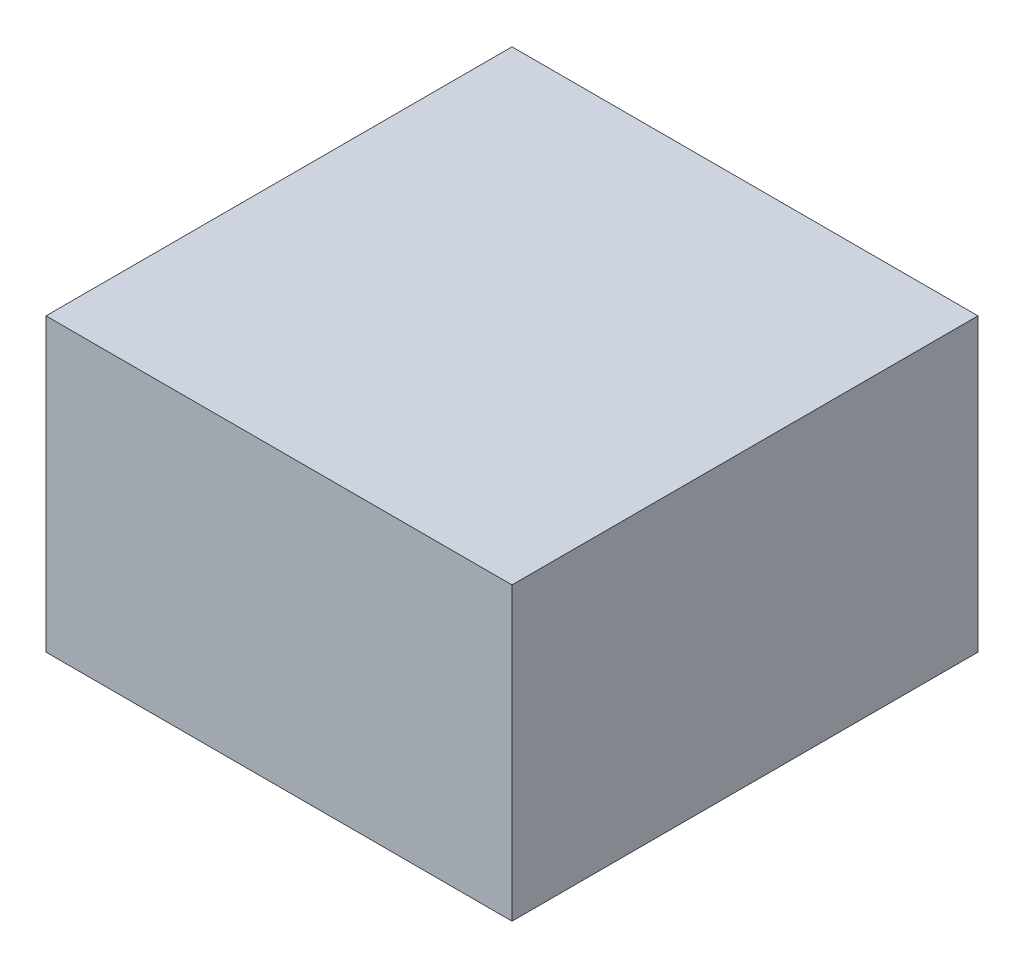
ISO-10303-21;
HEADER;
FILE_DESCRIPTION(('STEP AP214'),'2;1');
FILE_NAME('part.step','',(''),(''),'','','');
FILE_SCHEMA(('AUTOMOTIVE_DESIGN { 1 0 10303 214 1 1 1 1 }'));
ENDSEC;
DATA;
#1=APPLICATION_CONTEXT('core data for automotive mechanical design processes');
#2=APPLICATION_PROTOCOL_DEFINITION('international standard','automotive_design',2000,#1);
#3=PRODUCT_CONTEXT('',#1,'mechanical');
#4=PRODUCT('Part','Part','',(#3));
#5=PRODUCT_RELATED_PRODUCT_CATEGORY('part','',(#4));
#6=PRODUCT_DEFINITION_FORMATION('','',#4);
#7=PRODUCT_DEFINITION_CONTEXT('part definition',#1,'design');
#8=PRODUCT_DEFINITION('design','',#6,#7);
#9=PRODUCT_DEFINITION_SHAPE('','',#8);
#10=(LENGTH_UNIT() NAMED_UNIT(*) SI_UNIT(.MILLI.,.METRE.));
#11=(NAMED_UNIT(*) PLANE_ANGLE_UNIT() SI_UNIT($,.RADIAN.));
#12=(NAMED_UNIT(*) SI_UNIT($,.STERADIAN.) SOLID_ANGLE_UNIT());
#13=UNCERTAINTY_MEASURE_WITH_UNIT(LENGTH_MEASURE(1.E-05),#10,'distance_accuracy_value','');
#14=(GEOMETRIC_REPRESENTATION_CONTEXT(3) GLOBAL_UNCERTAINTY_ASSIGNED_CONTEXT((#13)) GLOBAL_UNIT_ASSIGNED_CONTEXT((#10,
#11,#12)) REPRESENTATION_CONTEXT('',''));
#15=CARTESIAN_POINT('',(0.,0.,0.));
#16=DIRECTION('',(0.,0.,1.));
#17=DIRECTION('',(1.,0.,0.));
#18=AXIS2_PLACEMENT_3D('',#15,#16,#17);
#19=CARTESIAN_POINT('',(-101.6,-63.5,101.6));
#20=DIRECTION('',(-1.,0.,0.));
#21=DIRECTION('',(0.,0.,1.));
#22=AXIS2_PLACEMENT_3D('',#19,#20,#21);
#23=PLANE('',#22);
#24=DIRECTION('',(0.,1.,0.));
#25=VECTOR('',#24,1.);
#26=CARTESIAN_POINT('',(-101.6,-63.5,101.6));
#27=LINE('',#26,#25);
#28=CARTESIAN_POINT('',(-101.6,-63.5,101.6));
#29=VERTEX_POINT('',#28);
#30=CARTESIAN_POINT('',(-101.6,63.5,101.6));
#31=VERTEX_POINT('',#30);
#32=EDGE_CURVE('E40',#29,#31,#27,.T.);
#33=ORIENTED_EDGE('',*,*,#32,.T.);
#34=DIRECTION('',(0.,0.,1.));
#35=VECTOR('',#34,1.);
#36=CARTESIAN_POINT('',(-101.6,63.5,101.6));
#37=LINE('',#36,#35);
#38=CARTESIAN_POINT('',(-101.6,63.5,-101.6));
#39=VERTEX_POINT('',#38);
#40=EDGE_CURVE('E77',#39,#31,#37,.T.);
#41=ORIENTED_EDGE('',*,*,#40,.F.);
#42=DIRECTION('',(0.,1.,0.));
#43=VECTOR('',#42,1.);
#44=CARTESIAN_POINT('',(-101.6,-63.5,-101.6));
#45=LINE('',#44,#43);
#46=CARTESIAN_POINT('',(-101.6,-63.5,-101.6));
#47=VERTEX_POINT('',#46);
#48=EDGE_CURVE('E11',#47,#39,#45,.T.);
#49=ORIENTED_EDGE('',*,*,#48,.F.);
#50=DIRECTION('',(0.,0.,1.));
#51=VECTOR('',#50,1.);
#52=CARTESIAN_POINT('',(-101.6,-63.5,101.6));
#53=LINE('',#52,#51);
#54=EDGE_CURVE('E78',#47,#29,#53,.T.);
#55=ORIENTED_EDGE('',*,*,#54,.T.);
#56=EDGE_LOOP('',(#33,#41,#49,#55));
#57=FACE_BOUND('',#56,.T.);
#58=ADVANCED_FACE('F37',(#57),#23,.T.);
#59=CARTESIAN_POINT('',(-101.6,-63.5,-101.6));
#60=DIRECTION('',(0.,0.,-1.));
#61=DIRECTION('',(-1.,0.,0.));
#62=AXIS2_PLACEMENT_3D('',#59,#60,#61);
#63=PLANE('',#62);
#64=ORIENTED_EDGE('',*,*,#48,.T.);
#65=DIRECTION('',(-1.,0.,0.));
#66=VECTOR('',#65,1.);
#67=CARTESIAN_POINT('',(-101.6,63.5,-101.6));
#68=LINE('',#67,#66);
#69=CARTESIAN_POINT('',(101.6,63.5,-101.6));
#70=VERTEX_POINT('',#69);
#71=EDGE_CURVE('E94',#70,#39,#68,.T.);
#72=ORIENTED_EDGE('',*,*,#71,.F.);
#73=DIRECTION('',(0.,1.,0.));
#74=VECTOR('',#73,1.);
#75=CARTESIAN_POINT('',(101.6,-63.5,-101.6));
#76=LINE('',#75,#74);
#77=CARTESIAN_POINT('',(101.6,-63.5,-101.6));
#78=VERTEX_POINT('',#77);
#79=EDGE_CURVE('E45',#78,#70,#76,.T.);
#80=ORIENTED_EDGE('',*,*,#79,.F.);
#81=DIRECTION('',(-1.,0.,0.));
#82=VECTOR('',#81,1.);
#83=CARTESIAN_POINT('',(-101.6,-63.5,-101.6));
#84=LINE('',#83,#82);
#85=EDGE_CURVE('E83',#78,#47,#84,.T.);
#86=ORIENTED_EDGE('',*,*,#85,.T.);
#87=EDGE_LOOP('',(#64,#72,#80,#86));
#88=FACE_BOUND('',#87,.T.);
#89=ADVANCED_FACE('F109',(#88),#63,.T.);
#90=CARTESIAN_POINT('',(101.6,-63.5,101.6));
#91=DIRECTION('',(1.,0.,0.));
#92=DIRECTION('',(0.,0.,-1.));
#93=AXIS2_PLACEMENT_3D('',#90,#91,#92);
#94=PLANE('',#93);
#95=ORIENTED_EDGE('',*,*,#79,.T.);
#96=DIRECTION('',(0.,0.,-1.));
#97=VECTOR('',#96,1.);
#98=CARTESIAN_POINT('',(101.6,63.5,101.6));
#99=LINE('',#98,#97);
#100=CARTESIAN_POINT('',(101.6,63.5,101.6));
#101=VERTEX_POINT('',#100);
#102=EDGE_CURVE('E90',#101,#70,#99,.T.);
#103=ORIENTED_EDGE('',*,*,#102,.F.);
#104=DIRECTION('',(0.,1.,0.));
#105=VECTOR('',#104,1.);
#106=CARTESIAN_POINT('',(101.6,-63.5,101.6));
#107=LINE('',#106,#105);
#108=CARTESIAN_POINT('',(101.6,-63.5,101.6));
#109=VERTEX_POINT('',#108);
#110=EDGE_CURVE('E82',#109,#101,#107,.T.);
#111=ORIENTED_EDGE('',*,*,#110,.F.);
#112=DIRECTION('',(0.,0.,-1.));
#113=VECTOR('',#112,1.);
#114=CARTESIAN_POINT('',(101.6,-63.5,101.6));
#115=LINE('',#114,#113);
#116=EDGE_CURVE('E102',#109,#78,#115,.T.);
#117=ORIENTED_EDGE('',*,*,#116,.T.);
#118=EDGE_LOOP('',(#95,#103,#111,#117));
#119=FACE_BOUND('',#118,.T.);
#120=ADVANCED_FACE('F106',(#119),#94,.T.);
#121=CARTESIAN_POINT('',(-101.6,-63.5,101.6));
#122=DIRECTION('',(0.,0.,1.));
#123=DIRECTION('',(1.,0.,0.));
#124=AXIS2_PLACEMENT_3D('',#121,#122,#123);
#125=PLANE('',#124);
#126=ORIENTED_EDGE('',*,*,#110,.T.);
#127=DIRECTION('',(1.,0.,0.));
#128=VECTOR('',#127,1.);
#129=CARTESIAN_POINT('',(-101.6,63.5,101.6));
#130=LINE('',#129,#128);
#131=EDGE_CURVE('E85',#31,#101,#130,.T.);
#132=ORIENTED_EDGE('',*,*,#131,.F.);
#133=ORIENTED_EDGE('',*,*,#32,.F.);
#134=DIRECTION('',(1.,0.,0.));
#135=VECTOR('',#134,1.);
#136=CARTESIAN_POINT('',(-101.6,-63.5,101.6));
#137=LINE('',#136,#135);
#138=EDGE_CURVE('E100',#29,#109,#137,.T.);
#139=ORIENTED_EDGE('',*,*,#138,.T.);
#140=EDGE_LOOP('',(#126,#132,#133,#139));
#141=FACE_BOUND('',#140,.T.);
#142=ADVANCED_FACE('F86',(#141),#125,.T.);
#143=CARTESIAN_POINT('',(0.,-63.5,0.));
#144=DIRECTION('',(0.,-1.,0.));
#145=DIRECTION('',(0.,0.,-1.));
#146=AXIS2_PLACEMENT_3D('',#143,#144,#145);
#147=PLANE('',#146);
#148=ORIENTED_EDGE('',*,*,#54,.F.);
#149=ORIENTED_EDGE('',*,*,#85,.F.);
#150=ORIENTED_EDGE('',*,*,#116,.F.);
#151=ORIENTED_EDGE('',*,*,#138,.F.);
#152=EDGE_LOOP('',(#148,#149,#150,#151));
#153=FACE_BOUND('',#152,.T.);
#154=ADVANCED_FACE('F111',(#153),#147,.T.);
#155=CARTESIAN_POINT('',(0.,63.5,0.));
#156=DIRECTION('',(0.,-1.,0.));
#157=DIRECTION('',(0.,0.,-1.));
#158=AXIS2_PLACEMENT_3D('',#155,#156,#157);
#159=PLANE('',#158);
#160=ORIENTED_EDGE('',*,*,#40,.T.);
#161=ORIENTED_EDGE('',*,*,#131,.T.);
#162=ORIENTED_EDGE('',*,*,#102,.T.);
#163=ORIENTED_EDGE('',*,*,#71,.T.);
#164=EDGE_LOOP('',(#160,#161,#162,#163));
#165=FACE_BOUND('',#164,.T.);
#166=ADVANCED_FACE('F93',(#165),#159,.F.);
#167=CLOSED_SHELL('',(#58,#89,#120,#142,#154,#166));
#168=MANIFOLD_SOLID_BREP('B2',#167);
#169=ADVANCED_BREP_SHAPE_REPRESENTATION('',(#18,#168),#14);
#170=SHAPE_DEFINITION_REPRESENTATION(#9,#169);
ENDSEC;
END-ISO-10303-21;
